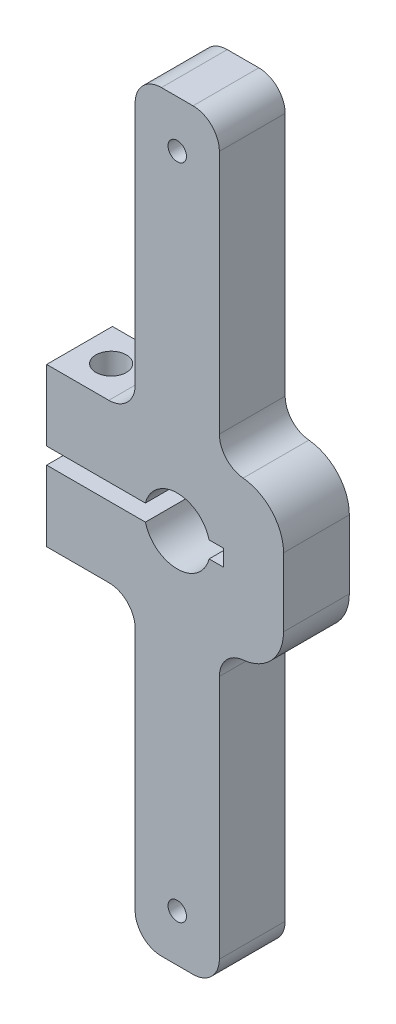
ISO-10303-21;
HEADER;
FILE_DESCRIPTION(('STEP AP214'),'2;1');
FILE_NAME('part.step','',(''),(''),'','','');
FILE_SCHEMA(('AUTOMOTIVE_DESIGN { 1 0 10303 214 1 1 1 1 }'));
ENDSEC;
DATA;
#1=APPLICATION_CONTEXT('core data for automotive mechanical design processes');
#2=APPLICATION_PROTOCOL_DEFINITION('international standard','automotive_design',2000,#1);
#3=PRODUCT_CONTEXT('',#1,'mechanical');
#4=PRODUCT('Part','Part','',(#3));
#5=PRODUCT_RELATED_PRODUCT_CATEGORY('part','',(#4));
#6=PRODUCT_DEFINITION_FORMATION('','',#4);
#7=PRODUCT_DEFINITION_CONTEXT('part definition',#1,'design');
#8=PRODUCT_DEFINITION('design','',#6,#7);
#9=PRODUCT_DEFINITION_SHAPE('','',#8);
#10=(LENGTH_UNIT() NAMED_UNIT(*) SI_UNIT(.MILLI.,.METRE.));
#11=(NAMED_UNIT(*) PLANE_ANGLE_UNIT() SI_UNIT($,.RADIAN.));
#12=(NAMED_UNIT(*) SI_UNIT($,.STERADIAN.) SOLID_ANGLE_UNIT());
#13=UNCERTAINTY_MEASURE_WITH_UNIT(LENGTH_MEASURE(1.E-05),#10,'distance_accuracy_value','');
#14=(GEOMETRIC_REPRESENTATION_CONTEXT(3) GLOBAL_UNCERTAINTY_ASSIGNED_CONTEXT((#13)) GLOBAL_UNIT_ASSIGNED_CONTEXT((#10,
#11,#12)) REPRESENTATION_CONTEXT('',''));
#15=CARTESIAN_POINT('',(0.,0.,0.));
#16=DIRECTION('',(0.,0.,1.));
#17=DIRECTION('',(1.,0.,0.));
#18=AXIS2_PLACEMENT_3D('',#15,#16,#17);
#19=CARTESIAN_POINT('',(-21.4924927341236,7.62,6.35));
#20=DIRECTION('',(0.,-1.,0.));
#21=DIRECTION('',(0.,0.,-1.));
#22=AXIS2_PLACEMENT_3D('',#19,#20,#21);
#23=PLANE('',#22);
#24=CARTESIAN_POINT('',(-18.4444927341236,7.62,3.175));
#25=DIRECTION('',(0.,-1.,0.));
#26=DIRECTION('',(0.,0.,-1.));
#27=AXIS2_PLACEMENT_3D('',#24,#25,#26);
#28=CIRCLE('',#27,1.4732);
#29=CARTESIAN_POINT('',(-18.4444927341236,7.62,1.7018));
#30=VERTEX_POINT('',#29);
#31=EDGE_CURVE('E315',#30,#30,#28,.T.);
#32=ORIENTED_EDGE('',*,*,#31,.T.);
#33=EDGE_LOOP('',(#32));
#34=FACE_BOUND('',#33,.T.);
#35=DIRECTION('',(-1.,0.,0.));
#36=VECTOR('',#35,1.);
#37=CARTESIAN_POINT('',(-6.25249273412365,7.62,6.35));
#38=LINE('',#37,#36);
#39=CARTESIAN_POINT('',(-15.494,7.62,6.35));
#40=VERTEX_POINT('',#39);
#41=CARTESIAN_POINT('',(-21.4924927341236,7.62,6.35));
#42=VERTEX_POINT('',#41);
#43=EDGE_CURVE('E267',#40,#42,#38,.T.);
#44=ORIENTED_EDGE('',*,*,#43,.F.);
#45=DIRECTION('',(0.,0.,1.));
#46=VECTOR('',#45,1.);
#47=CARTESIAN_POINT('',(-15.494,7.62,0.));
#48=LINE('',#47,#46);
#49=CARTESIAN_POINT('',(-15.494,7.62,0.));
#50=VERTEX_POINT('',#49);
#51=EDGE_CURVE('E356',#40,#50,#48,.F.);
#52=ORIENTED_EDGE('',*,*,#51,.T.);
#53=DIRECTION('',(-1.,0.,0.));
#54=VECTOR('',#53,1.);
#55=CARTESIAN_POINT('',(-21.4924927341236,7.62,0.));
#56=LINE('',#55,#54);
#57=CARTESIAN_POINT('',(-21.4924927341236,7.62,0.));
#58=VERTEX_POINT('',#57);
#59=EDGE_CURVE('E259',#50,#58,#56,.T.);
#60=ORIENTED_EDGE('',*,*,#59,.T.);
#61=DIRECTION('',(0.,0.,-1.));
#62=VECTOR('',#61,1.);
#63=CARTESIAN_POINT('',(-21.4924927341236,7.62,6.35));
#64=LINE('',#63,#62);
#65=EDGE_CURVE('E229',#42,#58,#64,.T.);
#66=ORIENTED_EDGE('',*,*,#65,.F.);
#67=EDGE_LOOP('',(#44,#52,#60,#66));
#68=FACE_BOUND('',#67,.T.);
#69=ADVANCED_FACE('F35',(#34,#68),#23,.F.);
#70=CARTESIAN_POINT('',(-4.445,-0.793749999999996,0.));
#71=DIRECTION('',(0.,-1.,0.));
#72=DIRECTION('',(1.,0.,0.));
#73=AXIS2_PLACEMENT_3D('',#70,#71,#72);
#74=PLANE('',#73);
#75=DIRECTION('',(1.,0.,0.));
#76=VECTOR('',#75,1.);
#77=CARTESIAN_POINT('',(-4.445,-0.793749999999996,0.));
#78=LINE('',#77,#76);
#79=CARTESIAN_POINT('',(-5.81581946894786,-0.793749999999997,0.));
#80=VERTEX_POINT('',#79);
#81=CARTESIAN_POINT('',(-4.445,-0.793749999999996,0.));
#82=VERTEX_POINT('',#81);
#83=EDGE_CURVE('E427',#80,#82,#78,.T.);
#84=ORIENTED_EDGE('',*,*,#83,.F.);
#85=DIRECTION('',(0.,0.,1.));
#86=VECTOR('',#85,1.);
#87=CARTESIAN_POINT('',(-5.81581946894786,-0.793749999999997,0.));
#88=LINE('',#87,#86);
#89=CARTESIAN_POINT('',(-5.81581946894786,-0.793749999999997,6.35));
#90=VERTEX_POINT('',#89);
#91=EDGE_CURVE('E418',#80,#90,#88,.T.);
#92=ORIENTED_EDGE('',*,*,#91,.T.);
#93=DIRECTION('',(1.,0.,0.));
#94=VECTOR('',#93,1.);
#95=CARTESIAN_POINT('',(-4.445,-0.793749999999996,6.35));
#96=LINE('',#95,#94);
#97=CARTESIAN_POINT('',(-4.445,-0.793749999999996,6.35));
#98=VERTEX_POINT('',#97);
#99=EDGE_CURVE('E246',#90,#98,#96,.T.);
#100=ORIENTED_EDGE('',*,*,#99,.T.);
#101=DIRECTION('',(0.,0.,1.));
#102=VECTOR('',#101,1.);
#103=CARTESIAN_POINT('',(-4.445,-0.793749999999996,0.));
#104=LINE('',#103,#102);
#105=EDGE_CURVE('E256',#82,#98,#104,.T.);
#106=ORIENTED_EDGE('',*,*,#105,.F.);
#107=EDGE_LOOP('',(#84,#92,#100,#106));
#108=FACE_BOUND('',#107,.T.);
#109=ADVANCED_FACE('F434',(#108),#74,.F.);
#110=CARTESIAN_POINT('',(-4.445,0.793750000000003,0.));
#111=DIRECTION('',(0.,1.,0.));
#112=DIRECTION('',(-1.,0.,0.));
#113=AXIS2_PLACEMENT_3D('',#110,#111,#112);
#114=PLANE('',#113);
#115=CARTESIAN_POINT('',(-18.4444927341236,0.793750000000001,3.175));
#116=DIRECTION('',(0.,1.,0.));
#117=DIRECTION('',(-1.,0.,0.));
#118=AXIS2_PLACEMENT_3D('',#115,#116,#117);
#119=CIRCLE('',#118,1.47319999999999);
#120=CARTESIAN_POINT('',(-19.9176927341236,0.793750000000001,3.175));
#121=VERTEX_POINT('',#120);
#122=EDGE_CURVE('E314',#121,#121,#119,.T.);
#123=ORIENTED_EDGE('',*,*,#122,.T.);
#124=EDGE_LOOP('',(#123));
#125=FACE_BOUND('',#124,.T.);
#126=DIRECTION('',(-1.,0.,0.));
#127=VECTOR('',#126,1.);
#128=CARTESIAN_POINT('',(-4.445,0.793750000000003,0.));
#129=LINE('',#128,#127);
#130=CARTESIAN_POINT('',(-11.9641805310521,0.793750000000002,0.));
#131=VERTEX_POINT('',#130);
#132=CARTESIAN_POINT('',(-21.4924927341236,0.79375,0.));
#133=VERTEX_POINT('',#132);
#134=EDGE_CURVE('E412',#131,#133,#129,.T.);
#135=ORIENTED_EDGE('',*,*,#134,.F.);
#136=DIRECTION('',(0.,0.,1.));
#137=VECTOR('',#136,1.);
#138=CARTESIAN_POINT('',(-11.9641805310521,0.793750000000002,0.));
#139=LINE('',#138,#137);
#140=CARTESIAN_POINT('',(-11.9641805310521,0.793750000000002,6.35));
#141=VERTEX_POINT('',#140);
#142=EDGE_CURVE('E228',#131,#141,#139,.T.);
#143=ORIENTED_EDGE('',*,*,#142,.T.);
#144=DIRECTION('',(-1.,0.,0.));
#145=VECTOR('',#144,1.);
#146=CARTESIAN_POINT('',(-4.445,0.793750000000003,6.35));
#147=LINE('',#146,#145);
#148=CARTESIAN_POINT('',(-21.4924927341236,0.793750000000001,6.35));
#149=VERTEX_POINT('',#148);
#150=EDGE_CURVE('E239',#141,#149,#147,.T.);
#151=ORIENTED_EDGE('',*,*,#150,.T.);
#152=DIRECTION('',(0.,0.,1.));
#153=VECTOR('',#152,1.);
#154=CARTESIAN_POINT('',(-21.4924927341236,0.793750000000001,0.));
#155=LINE('',#154,#153);
#156=EDGE_CURVE('E262',#133,#149,#155,.T.);
#157=ORIENTED_EDGE('',*,*,#156,.F.);
#158=EDGE_LOOP('',(#135,#143,#151,#157));
#159=FACE_BOUND('',#158,.T.);
#160=ADVANCED_FACE('F411',(#125,#159),#114,.F.);
#161=CARTESIAN_POINT('',(-21.4924927341236,-7.62,6.35));
#162=DIRECTION('',(1.,0.,0.));
#163=DIRECTION('',(0.,0.,-1.));
#164=AXIS2_PLACEMENT_3D('',#161,#162,#163);
#165=PLANE('',#164);
#166=DIRECTION('',(0.,-1.,0.));
#167=VECTOR('',#166,1.);
#168=CARTESIAN_POINT('',(-21.4924927341236,-7.62,6.35));
#169=LINE('',#168,#167);
#170=CARTESIAN_POINT('',(-21.4924927341236,-0.793750000000002,6.35));
#171=VERTEX_POINT('',#170);
#172=CARTESIAN_POINT('',(-21.4924927341236,-7.62,6.35));
#173=VERTEX_POINT('',#172);
#174=EDGE_CURVE('E269',#171,#173,#169,.T.);
#175=ORIENTED_EDGE('',*,*,#174,.F.);
#176=DIRECTION('',(0.,0.,1.));
#177=VECTOR('',#176,1.);
#178=CARTESIAN_POINT('',(-21.4924927341236,-0.793750000000002,0.));
#179=LINE('',#178,#177);
#180=CARTESIAN_POINT('',(-21.4924927341236,-0.793750000000002,0.));
#181=VERTEX_POINT('',#180);
#182=EDGE_CURVE('E260',#181,#171,#179,.T.);
#183=ORIENTED_EDGE('',*,*,#182,.F.);
#184=DIRECTION('',(0.,-1.,0.));
#185=VECTOR('',#184,1.);
#186=CARTESIAN_POINT('',(-21.4924927341236,-7.62,0.));
#187=LINE('',#186,#185);
#188=CARTESIAN_POINT('',(-21.4924927341236,-7.62,0.));
#189=VERTEX_POINT('',#188);
#190=EDGE_CURVE('E281',#181,#189,#187,.T.);
#191=ORIENTED_EDGE('',*,*,#190,.T.);
#192=DIRECTION('',(0.,0.,-1.));
#193=VECTOR('',#192,1.);
#194=CARTESIAN_POINT('',(-21.4924927341236,-7.62,6.35));
#195=LINE('',#194,#193);
#196=EDGE_CURVE('E279',#173,#189,#195,.T.);
#197=ORIENTED_EDGE('',*,*,#196,.F.);
#198=EDGE_LOOP('',(#175,#183,#191,#197));
#199=FACE_BOUND('',#198,.T.);
#200=ADVANCED_FACE('F446',(#199),#165,.F.);
#201=EDGE_CURVE('E282',#58,#133,#187,.T.);
#202=ORIENTED_EDGE('',*,*,#201,.T.);
#203=ORIENTED_EDGE('',*,*,#156,.T.);
#204=EDGE_CURVE('E271',#42,#149,#169,.T.);
#205=ORIENTED_EDGE('',*,*,#204,.F.);
#206=ORIENTED_EDGE('',*,*,#65,.T.);
#207=EDGE_LOOP('',(#202,#203,#205,#206));
#208=FACE_BOUND('',#207,.T.);
#209=ADVANCED_FACE('F407',(#208),#165,.F.);
#210=CARTESIAN_POINT('',(-6.25249273412365,-7.62,6.35));
#211=DIRECTION('',(0.,1.,0.));
#212=DIRECTION('',(0.,0.,1.));
#213=AXIS2_PLACEMENT_3D('',#210,#211,#212);
#214=PLANE('',#213);
#215=CARTESIAN_POINT('',(-18.4444927341236,-7.62,3.175));
#216=DIRECTION('',(0.,-1.,0.));
#217=DIRECTION('',(0.,0.,-1.));
#218=AXIS2_PLACEMENT_3D('',#215,#216,#217);
#219=CIRCLE('',#218,1.47319999999999);
#220=CARTESIAN_POINT('',(-18.4444927341236,-7.62,1.70180000000001));
#221=VERTEX_POINT('',#220);
#222=EDGE_CURVE('E398',#221,#221,#219,.T.);
#223=ORIENTED_EDGE('',*,*,#222,.F.);
#224=EDGE_LOOP('',(#223));
#225=FACE_BOUND('',#224,.T.);
#226=DIRECTION('',(1.,0.,0.));
#227=VECTOR('',#226,1.);
#228=CARTESIAN_POINT('',(-6.25249273412365,-7.62,0.));
#229=LINE('',#228,#227);
#230=CARTESIAN_POINT('',(-15.494,-7.62,0.));
#231=VERTEX_POINT('',#230);
#232=EDGE_CURVE('E285',#189,#231,#229,.T.);
#233=ORIENTED_EDGE('',*,*,#232,.T.);
#234=DIRECTION('',(0.,0.,1.));
#235=VECTOR('',#234,1.);
#236=CARTESIAN_POINT('',(-15.494,-7.62,6.35));
#237=LINE('',#236,#235);
#238=CARTESIAN_POINT('',(-15.494,-7.62,6.35));
#239=VERTEX_POINT('',#238);
#240=EDGE_CURVE('E340',#231,#239,#237,.T.);
#241=ORIENTED_EDGE('',*,*,#240,.T.);
#242=DIRECTION('',(1.,0.,0.));
#243=VECTOR('',#242,1.);
#244=CARTESIAN_POINT('',(-21.4924927341236,-7.62,6.35));
#245=LINE('',#244,#243);
#246=EDGE_CURVE('E273',#173,#239,#245,.T.);
#247=ORIENTED_EDGE('',*,*,#246,.F.);
#248=ORIENTED_EDGE('',*,*,#196,.T.);
#249=EDGE_LOOP('',(#233,#241,#247,#248));
#250=FACE_BOUND('',#249,.T.);
#251=ADVANCED_FACE('F454',(#225,#250),#214,.F.);
#252=CARTESIAN_POINT('',(1.36750726587635,7.62,6.35));
#253=DIRECTION('',(-1.,0.,0.));
#254=DIRECTION('',(0.,-1.,0.));
#255=AXIS2_PLACEMENT_3D('',#252,#253,#254);
#256=PLANE('',#255);
#257=DIRECTION('',(0.,1.,0.));
#258=VECTOR('',#257,1.);
#259=CARTESIAN_POINT('',(1.36750726587635,0.,6.35));
#260=LINE('',#259,#258);
#261=CARTESIAN_POINT('',(1.36750726587635,-3.302,6.35));
#262=VERTEX_POINT('',#261);
#263=CARTESIAN_POINT('',(1.36750726587635,3.302,6.35));
#264=VERTEX_POINT('',#263);
#265=EDGE_CURVE('E276',#262,#264,#260,.T.);
#266=ORIENTED_EDGE('',*,*,#265,.F.);
#267=DIRECTION('',(0.,0.,-1.));
#268=VECTOR('',#267,1.);
#269=CARTESIAN_POINT('',(1.36750726587635,-3.302,6.35));
#270=LINE('',#269,#268);
#271=CARTESIAN_POINT('',(1.36750726587635,-3.302,0.));
#272=VERTEX_POINT('',#271);
#273=EDGE_CURVE('E297',#262,#272,#270,.T.);
#274=ORIENTED_EDGE('',*,*,#273,.T.);
#275=DIRECTION('',(0.,1.,0.));
#276=VECTOR('',#275,1.);
#277=CARTESIAN_POINT('',(1.36750726587635,7.62,0.));
#278=LINE('',#277,#276);
#279=CARTESIAN_POINT('',(1.36750726587635,3.302,0.));
#280=VERTEX_POINT('',#279);
#281=EDGE_CURVE('E270',#272,#280,#278,.T.);
#282=ORIENTED_EDGE('',*,*,#281,.T.);
#283=DIRECTION('',(0.,0.,-1.));
#284=VECTOR('',#283,1.);
#285=CARTESIAN_POINT('',(1.36750726587635,3.302,6.35));
#286=LINE('',#285,#284);
#287=EDGE_CURVE('E295',#280,#264,#286,.F.);
#288=ORIENTED_EDGE('',*,*,#287,.T.);
#289=EDGE_LOOP('',(#266,#274,#282,#288));
#290=FACE_BOUND('',#289,.T.);
#291=ADVANCED_FACE('F643',(#290),#256,.F.);
#292=CARTESIAN_POINT('',(1.36750726587635,7.62,6.35));
#293=DIRECTION('',(0.,0.,-1.));
#294=DIRECTION('',(-1.,0.,0.));
#295=AXIS2_PLACEMENT_3D('',#292,#293,#294);
#296=PLANE('',#295);
#297=CARTESIAN_POINT('',(-8.89,-31.75,6.35));
#298=DIRECTION('',(0.,0.,-1.));
#299=DIRECTION('',(-1.,0.,0.));
#300=AXIS2_PLACEMENT_3D('',#297,#298,#299);
#301=CIRCLE('',#300,0.888999999999997);
#302=CARTESIAN_POINT('',(-9.77899999999999,-31.75,6.35));
#303=VERTEX_POINT('',#302);
#304=EDGE_CURVE('E582',#303,#303,#301,.T.);
#305=ORIENTED_EDGE('',*,*,#304,.T.);
#306=EDGE_LOOP('',(#305));
#307=FACE_BOUND('',#306,.T.);
#308=CARTESIAN_POINT('',(-8.89,31.75,6.35));
#309=DIRECTION('',(0.,0.,-1.));
#310=DIRECTION('',(-1.,0.,0.));
#311=AXIS2_PLACEMENT_3D('',#308,#309,#310);
#312=CIRCLE('',#311,0.888999999999997);
#313=CARTESIAN_POINT('',(-9.77899999999999,31.75,6.35));
#314=VERTEX_POINT('',#313);
#315=EDGE_CURVE('E604',#314,#314,#312,.T.);
#316=ORIENTED_EDGE('',*,*,#315,.T.);
#317=EDGE_LOOP('',(#316));
#318=FACE_BOUND('',#317,.T.);
#319=DIRECTION('',(0.,1.,0.));
#320=VECTOR('',#319,1.);
#321=CARTESIAN_POINT('',(-12.954,-36.2966,6.35));
#322=LINE('',#321,#320);
#323=CARTESIAN_POINT('',(-12.954,-33.7566,6.35));
#324=VERTEX_POINT('',#323);
#325=CARTESIAN_POINT('',(-12.954,-10.16,6.35));
#326=VERTEX_POINT('',#325);
#327=EDGE_CURVE('E456',#324,#326,#322,.T.);
#328=ORIENTED_EDGE('',*,*,#327,.F.);
#329=CARTESIAN_POINT('',(-10.414,-33.7566,6.35));
#330=DIRECTION('',(0.,0.,-1.));
#331=DIRECTION('',(-1.,0.,0.));
#332=AXIS2_PLACEMENT_3D('',#329,#330,#331);
#333=CIRCLE('',#332,2.54);
#334=CARTESIAN_POINT('',(-10.414,-36.2966,6.35));
#335=VERTEX_POINT('',#334);
#336=EDGE_CURVE('E326',#324,#335,#333,.F.);
#337=ORIENTED_EDGE('',*,*,#336,.T.);
#338=DIRECTION('',(1.,0.,0.));
#339=VECTOR('',#338,1.);
#340=CARTESIAN_POINT('',(-4.82599999999999,-36.2966,6.35));
#341=LINE('',#340,#339);
#342=CARTESIAN_POINT('',(-7.366,-36.2966,6.35));
#343=VERTEX_POINT('',#342);
#344=EDGE_CURVE('E592',#335,#343,#341,.T.);
#345=ORIENTED_EDGE('',*,*,#344,.T.);
#346=CARTESIAN_POINT('',(-7.366,-33.7566,6.35));
#347=DIRECTION('',(0.,0.,-1.));
#348=DIRECTION('',(-1.,0.,0.));
#349=AXIS2_PLACEMENT_3D('',#346,#347,#348);
#350=CIRCLE('',#349,2.54);
#351=CARTESIAN_POINT('',(-4.82599999999999,-33.7566,6.35));
#352=VERTEX_POINT('',#351);
#353=EDGE_CURVE('E324',#343,#352,#350,.F.);
#354=ORIENTED_EDGE('',*,*,#353,.T.);
#355=DIRECTION('',(0.,1.,0.));
#356=VECTOR('',#355,1.);
#357=CARTESIAN_POINT('',(-4.82599999999999,-36.2966,6.35));
#358=LINE('',#357,#356);
#359=CARTESIAN_POINT('',(-4.82599999999999,-10.1277317121534,6.35));
#360=VERTEX_POINT('',#359);
#361=EDGE_CURVE('E463',#352,#360,#358,.T.);
#362=ORIENTED_EDGE('',*,*,#361,.T.);
#363=CARTESIAN_POINT('',(-2.28599999999999,-10.1277317121534,6.35));
#364=DIRECTION('',(0.,0.,-1.));
#365=DIRECTION('',(-1.,0.,0.));
#366=AXIS2_PLACEMENT_3D('',#363,#364,#365);
#367=CIRCLE('',#366,2.54);
#368=CARTESIAN_POINT('',(-2.53210842004579,-7.59968292987438,6.35));
#369=VERTEX_POINT('',#368);
#370=EDGE_CURVE('E376',#360,#369,#367,.T.);
#371=ORIENTED_EDGE('',*,*,#370,.T.);
#372=CARTESIAN_POINT('',(-2.95049273412365,-3.302,6.35));
#373=DIRECTION('',(0.,0.,-1.));
#374=DIRECTION('',(-1.,0.,0.));
#375=AXIS2_PLACEMENT_3D('',#372,#373,#374);
#376=CIRCLE('',#375,4.318);
#377=EDGE_CURVE('E308',#369,#262,#376,.F.);
#378=ORIENTED_EDGE('',*,*,#377,.T.);
#379=ORIENTED_EDGE('',*,*,#265,.T.);
#380=CARTESIAN_POINT('',(-2.95049273412365,3.302,6.35));
#381=DIRECTION('',(0.,0.,-1.));
#382=DIRECTION('',(-1.,0.,0.));
#383=AXIS2_PLACEMENT_3D('',#380,#381,#382);
#384=CIRCLE('',#383,4.318);
#385=CARTESIAN_POINT('',(-2.53210842004579,7.59968292987438,6.35));
#386=VERTEX_POINT('',#385);
#387=EDGE_CURVE('E305',#264,#386,#384,.F.);
#388=ORIENTED_EDGE('',*,*,#387,.T.);
#389=CARTESIAN_POINT('',(-2.28599999999999,10.1277317121534,6.35));
#390=DIRECTION('',(0.,0.,-1.));
#391=DIRECTION('',(-1.,0.,0.));
#392=AXIS2_PLACEMENT_3D('',#389,#390,#391);
#393=CIRCLE('',#392,2.54);
#394=CARTESIAN_POINT('',(-4.82599999999999,10.1277317121534,6.35));
#395=VERTEX_POINT('',#394);
#396=EDGE_CURVE('E11',#386,#395,#393,.T.);
#397=ORIENTED_EDGE('',*,*,#396,.T.);
#398=DIRECTION('',(0.,-1.,0.));
#399=VECTOR('',#398,1.);
#400=CARTESIAN_POINT('',(-4.82599999999999,36.2966,6.35));
#401=LINE('',#400,#399);
#402=CARTESIAN_POINT('',(-4.82599999999999,33.7566,6.35));
#403=VERTEX_POINT('',#402);
#404=EDGE_CURVE('E514',#403,#395,#401,.T.);
#405=ORIENTED_EDGE('',*,*,#404,.F.);
#406=CARTESIAN_POINT('',(-7.366,33.7566,6.35));
#407=DIRECTION('',(0.,0.,-1.));
#408=DIRECTION('',(-1.,0.,0.));
#409=AXIS2_PLACEMENT_3D('',#406,#407,#408);
#410=CIRCLE('',#409,2.54);
#411=CARTESIAN_POINT('',(-7.366,36.2966,6.35));
#412=VERTEX_POINT('',#411);
#413=EDGE_CURVE('E320',#403,#412,#410,.F.);
#414=ORIENTED_EDGE('',*,*,#413,.T.);
#415=DIRECTION('',(1.,0.,0.));
#416=VECTOR('',#415,1.);
#417=CARTESIAN_POINT('',(-4.82599999999999,36.2966,6.35));
#418=LINE('',#417,#416);
#419=CARTESIAN_POINT('',(-10.414,36.2966,6.35));
#420=VERTEX_POINT('',#419);
#421=EDGE_CURVE('E523',#420,#412,#418,.T.);
#422=ORIENTED_EDGE('',*,*,#421,.F.);
#423=CARTESIAN_POINT('',(-10.414,33.7566,6.35));
#424=DIRECTION('',(0.,0.,-1.));
#425=DIRECTION('',(-1.,0.,0.));
#426=AXIS2_PLACEMENT_3D('',#423,#424,#425);
#427=CIRCLE('',#426,2.54);
#428=CARTESIAN_POINT('',(-12.954,33.7566,6.35));
#429=VERTEX_POINT('',#428);
#430=EDGE_CURVE('E322',#420,#429,#427,.F.);
#431=ORIENTED_EDGE('',*,*,#430,.T.);
#432=DIRECTION('',(0.,-1.,0.));
#433=VECTOR('',#432,1.);
#434=CARTESIAN_POINT('',(-12.954,36.2966,6.35));
#435=LINE('',#434,#433);
#436=CARTESIAN_POINT('',(-12.954,10.16,6.35));
#437=VERTEX_POINT('',#436);
#438=EDGE_CURVE('E399',#429,#437,#435,.T.);
#439=ORIENTED_EDGE('',*,*,#438,.T.);
#440=CARTESIAN_POINT('',(-15.494,10.16,6.35));
#441=DIRECTION('',(0.,0.,-1.));
#442=DIRECTION('',(-1.,0.,0.));
#443=AXIS2_PLACEMENT_3D('',#440,#441,#442);
#444=CIRCLE('',#443,2.54);
#445=EDGE_CURVE('E378',#437,#40,#444,.T.);
#446=ORIENTED_EDGE('',*,*,#445,.T.);
#447=ORIENTED_EDGE('',*,*,#43,.T.);
#448=ORIENTED_EDGE('',*,*,#204,.T.);
#449=ORIENTED_EDGE('',*,*,#150,.F.);
#450=CARTESIAN_POINT('',(-8.89,0.,6.35));
#451=DIRECTION('',(0.,0.,1.));
#452=DIRECTION('',(1.,0.,0.));
#453=AXIS2_PLACEMENT_3D('',#450,#451,#452);
#454=CIRCLE('',#453,3.175);
#455=CARTESIAN_POINT('',(-5.81581946894786,0.793750000000003,6.35));
#456=VERTEX_POINT('',#455);
#457=EDGE_CURVE('E220',#456,#141,#454,.T.);
#458=ORIENTED_EDGE('',*,*,#457,.F.);
#459=CARTESIAN_POINT('',(-4.445,0.793750000000003,6.35));
#460=VERTEX_POINT('',#459);
#461=EDGE_CURVE('E237',#460,#456,#147,.T.);
#462=ORIENTED_EDGE('',*,*,#461,.F.);
#463=DIRECTION('',(0.,1.,0.));
#464=VECTOR('',#463,1.);
#465=CARTESIAN_POINT('',(-4.445,-0.793749999999996,6.35));
#466=LINE('',#465,#464);
#467=EDGE_CURVE('E250',#98,#460,#466,.T.);
#468=ORIENTED_EDGE('',*,*,#467,.F.);
#469=ORIENTED_EDGE('',*,*,#99,.F.);
#470=CARTESIAN_POINT('',(-11.9641805310521,-0.793749999999999,6.35));
#471=VERTEX_POINT('',#470);
#472=EDGE_CURVE('E241',#471,#90,#454,.T.);
#473=ORIENTED_EDGE('',*,*,#472,.F.);
#474=EDGE_CURVE('E248',#171,#471,#96,.T.);
#475=ORIENTED_EDGE('',*,*,#474,.F.);
#476=ORIENTED_EDGE('',*,*,#174,.T.);
#477=ORIENTED_EDGE('',*,*,#246,.T.);
#478=CARTESIAN_POINT('',(-15.494,-10.16,6.35));
#479=DIRECTION('',(0.,0.,-1.));
#480=DIRECTION('',(-1.,0.,0.));
#481=AXIS2_PLACEMENT_3D('',#478,#479,#480);
#482=CIRCLE('',#481,2.54);
#483=EDGE_CURVE('E370',#239,#326,#482,.T.);
#484=ORIENTED_EDGE('',*,*,#483,.T.);
#485=EDGE_LOOP('',(#328,#337,#345,#354,#362,#371,#378,#379,#388,#397,#405,#414,#422,#431,#439,
#446,#447,#448,#449,#458,#462,#468,#469,#473,#475,#476,#477,#484));
#486=FACE_BOUND('',#485,.T.);
#487=ADVANCED_FACE('F235',(#307,#318,#486),#296,.F.);
#488=CARTESIAN_POINT('',(1.36750726587635,7.62,0.));
#489=DIRECTION('',(0.,0.,-1.));
#490=DIRECTION('',(-1.,0.,0.));
#491=AXIS2_PLACEMENT_3D('',#488,#489,#490);
#492=PLANE('',#491);
#493=CARTESIAN_POINT('',(-8.89,-31.75,0.));
#494=DIRECTION('',(0.,0.,-1.));
#495=DIRECTION('',(-1.,0.,0.));
#496=AXIS2_PLACEMENT_3D('',#493,#494,#495);
#497=CIRCLE('',#496,0.888999999999999);
#498=CARTESIAN_POINT('',(-9.77899999999999,-31.75,0.));
#499=VERTEX_POINT('',#498);
#500=EDGE_CURVE('E585',#499,#499,#497,.T.);
#501=ORIENTED_EDGE('',*,*,#500,.F.);
#502=EDGE_LOOP('',(#501));
#503=FACE_BOUND('',#502,.T.);
#504=CARTESIAN_POINT('',(-8.89,31.75,0.));
#505=DIRECTION('',(0.,0.,-1.));
#506=DIRECTION('',(-1.,0.,0.));
#507=AXIS2_PLACEMENT_3D('',#504,#505,#506);
#508=CIRCLE('',#507,0.888999999999999);
#509=CARTESIAN_POINT('',(-9.77899999999999,31.75,0.));
#510=VERTEX_POINT('',#509);
#511=EDGE_CURVE('E601',#510,#510,#508,.T.);
#512=ORIENTED_EDGE('',*,*,#511,.F.);
#513=EDGE_LOOP('',(#512));
#514=FACE_BOUND('',#513,.T.);
#515=DIRECTION('',(-1.,0.,0.));
#516=VECTOR('',#515,1.);
#517=CARTESIAN_POINT('',(-12.954,-36.2966,0.));
#518=LINE('',#517,#516);
#519=CARTESIAN_POINT('',(-7.366,-36.2966,0.));
#520=VERTEX_POINT('',#519);
#521=CARTESIAN_POINT('',(-10.414,-36.2966,0.));
#522=VERTEX_POINT('',#521);
#523=EDGE_CURVE('E588',#520,#522,#518,.T.);
#524=ORIENTED_EDGE('',*,*,#523,.T.);
#525=CARTESIAN_POINT('',(-10.414,-33.7566,0.));
#526=DIRECTION('',(0.,0.,-1.));
#527=DIRECTION('',(-1.,0.,0.));
#528=AXIS2_PLACEMENT_3D('',#525,#526,#527);
#529=CIRCLE('',#528,2.54);
#530=CARTESIAN_POINT('',(-12.954,-33.7566,0.));
#531=VERTEX_POINT('',#530);
#532=EDGE_CURVE('E338',#522,#531,#529,.T.);
#533=ORIENTED_EDGE('',*,*,#532,.T.);
#534=DIRECTION('',(0.,1.,0.));
#535=VECTOR('',#534,1.);
#536=CARTESIAN_POINT('',(-12.954,-36.2966,0.));
#537=LINE('',#536,#535);
#538=CARTESIAN_POINT('',(-12.954,-10.16,0.));
#539=VERTEX_POINT('',#538);
#540=EDGE_CURVE('E464',#531,#539,#537,.T.);
#541=ORIENTED_EDGE('',*,*,#540,.T.);
#542=CARTESIAN_POINT('',(-15.494,-10.16,0.));
#543=DIRECTION('',(0.,0.,-1.));
#544=DIRECTION('',(-1.,0.,0.));
#545=AXIS2_PLACEMENT_3D('',#542,#543,#544);
#546=CIRCLE('',#545,2.54);
#547=EDGE_CURVE('E372',#539,#231,#546,.F.);
#548=ORIENTED_EDGE('',*,*,#547,.T.);
#549=ORIENTED_EDGE('',*,*,#232,.F.);
#550=ORIENTED_EDGE('',*,*,#190,.F.);
#551=CARTESIAN_POINT('',(-11.9641805310521,-0.793749999999999,0.));
#552=VERTEX_POINT('',#551);
#553=EDGE_CURVE('E266',#181,#552,#78,.T.);
#554=ORIENTED_EDGE('',*,*,#553,.T.);
#555=CARTESIAN_POINT('',(-8.89,0.,0.));
#556=DIRECTION('',(0.,0.,1.));
#557=DIRECTION('',(1.,0.,0.));
#558=AXIS2_PLACEMENT_3D('',#555,#556,#557);
#559=CIRCLE('',#558,3.175);
#560=EDGE_CURVE('E240',#552,#80,#559,.T.);
#561=ORIENTED_EDGE('',*,*,#560,.T.);
#562=ORIENTED_EDGE('',*,*,#83,.T.);
#563=DIRECTION('',(0.,1.,0.));
#564=VECTOR('',#563,1.);
#565=CARTESIAN_POINT('',(-4.445,-0.793749999999996,0.));
#566=LINE('',#565,#564);
#567=CARTESIAN_POINT('',(-4.445,0.793750000000003,0.));
#568=VERTEX_POINT('',#567);
#569=EDGE_CURVE('E255',#82,#568,#566,.T.);
#570=ORIENTED_EDGE('',*,*,#569,.T.);
#571=CARTESIAN_POINT('',(-5.81581946894786,0.793750000000003,0.));
#572=VERTEX_POINT('',#571);
#573=EDGE_CURVE('E414',#568,#572,#129,.T.);
#574=ORIENTED_EDGE('',*,*,#573,.T.);
#575=EDGE_CURVE('E223',#572,#131,#559,.T.);
#576=ORIENTED_EDGE('',*,*,#575,.T.);
#577=ORIENTED_EDGE('',*,*,#134,.T.);
#578=ORIENTED_EDGE('',*,*,#201,.F.);
#579=ORIENTED_EDGE('',*,*,#59,.F.);
#580=CARTESIAN_POINT('',(-15.494,10.16,0.));
#581=DIRECTION('',(0.,0.,-1.));
#582=DIRECTION('',(-1.,0.,0.));
#583=AXIS2_PLACEMENT_3D('',#580,#581,#582);
#584=CIRCLE('',#583,2.54);
#585=CARTESIAN_POINT('',(-12.954,10.16,0.));
#586=VERTEX_POINT('',#585);
#587=EDGE_CURVE('E380',#50,#586,#584,.F.);
#588=ORIENTED_EDGE('',*,*,#587,.T.);
#589=DIRECTION('',(0.,-1.,0.));
#590=VECTOR('',#589,1.);
#591=CARTESIAN_POINT('',(-12.954,36.2966,0.));
#592=LINE('',#591,#590);
#593=CARTESIAN_POINT('',(-12.954,33.7566,0.));
#594=VERTEX_POINT('',#593);
#595=EDGE_CURVE('E387',#594,#586,#592,.T.);
#596=ORIENTED_EDGE('',*,*,#595,.F.);
#597=CARTESIAN_POINT('',(-10.414,33.7566,0.));
#598=DIRECTION('',(0.,0.,-1.));
#599=DIRECTION('',(-1.,0.,0.));
#600=AXIS2_PLACEMENT_3D('',#597,#598,#599);
#601=CIRCLE('',#600,2.54);
#602=CARTESIAN_POINT('',(-10.414,36.2966,0.));
#603=VERTEX_POINT('',#602);
#604=EDGE_CURVE('E334',#594,#603,#601,.T.);
#605=ORIENTED_EDGE('',*,*,#604,.T.);
#606=DIRECTION('',(-1.,0.,0.));
#607=VECTOR('',#606,1.);
#608=CARTESIAN_POINT('',(-12.954,36.2966,0.));
#609=LINE('',#608,#607);
#610=CARTESIAN_POINT('',(-7.366,36.2966,0.));
#611=VERTEX_POINT('',#610);
#612=EDGE_CURVE('E607',#611,#603,#609,.T.);
#613=ORIENTED_EDGE('',*,*,#612,.F.);
#614=CARTESIAN_POINT('',(-7.366,33.7566,0.));
#615=DIRECTION('',(0.,0.,-1.));
#616=DIRECTION('',(-1.,0.,0.));
#617=AXIS2_PLACEMENT_3D('',#614,#615,#616);
#618=CIRCLE('',#617,2.54);
#619=CARTESIAN_POINT('',(-4.826,33.7566,0.));
#620=VERTEX_POINT('',#619);
#621=EDGE_CURVE('E332',#611,#620,#618,.T.);
#622=ORIENTED_EDGE('',*,*,#621,.T.);
#623=DIRECTION('',(0.,-1.,0.));
#624=VECTOR('',#623,1.);
#625=CARTESIAN_POINT('',(-4.826,36.2966,0.));
#626=LINE('',#625,#624);
#627=CARTESIAN_POINT('',(-4.826,10.1277317121534,0.));
#628=VERTEX_POINT('',#627);
#629=EDGE_CURVE('E520',#620,#628,#626,.T.);
#630=ORIENTED_EDGE('',*,*,#629,.T.);
#631=CARTESIAN_POINT('',(-2.28599999999999,10.1277317121534,0.));
#632=DIRECTION('',(0.,0.,-1.));
#633=DIRECTION('',(-1.,0.,0.));
#634=AXIS2_PLACEMENT_3D('',#631,#632,#633);
#635=CIRCLE('',#634,2.54);
#636=CARTESIAN_POINT('',(-2.53210842004579,7.59968292987438,0.));
#637=VERTEX_POINT('',#636);
#638=EDGE_CURVE('E43',#628,#637,#635,.F.);
#639=ORIENTED_EDGE('',*,*,#638,.T.);
#640=CARTESIAN_POINT('',(-2.95049273412365,3.302,0.));
#641=DIRECTION('',(0.,0.,-1.));
#642=DIRECTION('',(-1.,0.,0.));
#643=AXIS2_PLACEMENT_3D('',#640,#641,#642);
#644=CIRCLE('',#643,4.318);
#645=EDGE_CURVE('E300',#637,#280,#644,.T.);
#646=ORIENTED_EDGE('',*,*,#645,.T.);
#647=ORIENTED_EDGE('',*,*,#281,.F.);
#648=CARTESIAN_POINT('',(-2.95049273412365,-3.302,0.));
#649=DIRECTION('',(0.,0.,-1.));
#650=DIRECTION('',(-1.,0.,0.));
#651=AXIS2_PLACEMENT_3D('',#648,#649,#650);
#652=CIRCLE('',#651,4.318);
#653=CARTESIAN_POINT('',(-2.53210842004579,-7.59968292987438,0.));
#654=VERTEX_POINT('',#653);
#655=EDGE_CURVE('E302',#272,#654,#652,.T.);
#656=ORIENTED_EDGE('',*,*,#655,.T.);
#657=CARTESIAN_POINT('',(-2.28599999999999,-10.1277317121534,0.));
#658=DIRECTION('',(0.,0.,-1.));
#659=DIRECTION('',(-1.,0.,0.));
#660=AXIS2_PLACEMENT_3D('',#657,#658,#659);
#661=CIRCLE('',#660,2.54);
#662=CARTESIAN_POINT('',(-4.826,-10.1277317121534,0.));
#663=VERTEX_POINT('',#662);
#664=EDGE_CURVE('E374',#654,#663,#661,.F.);
#665=ORIENTED_EDGE('',*,*,#664,.T.);
#666=DIRECTION('',(0.,1.,0.));
#667=VECTOR('',#666,1.);
#668=CARTESIAN_POINT('',(-4.826,-36.2966,0.));
#669=LINE('',#668,#667);
#670=CARTESIAN_POINT('',(-4.826,-33.7566,0.));
#671=VERTEX_POINT('',#670);
#672=EDGE_CURVE('E598',#671,#663,#669,.T.);
#673=ORIENTED_EDGE('',*,*,#672,.F.);
#674=CARTESIAN_POINT('',(-7.366,-33.7566,0.));
#675=DIRECTION('',(0.,0.,-1.));
#676=DIRECTION('',(-1.,0.,0.));
#677=AXIS2_PLACEMENT_3D('',#674,#675,#676);
#678=CIRCLE('',#677,2.54);
#679=EDGE_CURVE('E336',#671,#520,#678,.T.);
#680=ORIENTED_EDGE('',*,*,#679,.T.);
#681=EDGE_LOOP('',(#524,#533,#541,#548,#549,#550,#554,#561,#562,#570,#574,#576,#577,#578,#579,
#588,#596,#605,#613,#622,#630,#639,#646,#647,#656,#665,#673,#680));
#682=FACE_BOUND('',#681,.T.);
#683=ADVANCED_FACE('F386',(#503,#514,#682),#492,.T.);
#684=CARTESIAN_POINT('',(-4.445,-0.793749999999996,0.));
#685=DIRECTION('',(1.,0.,0.));
#686=DIRECTION('',(0.,0.,-1.));
#687=AXIS2_PLACEMENT_3D('',#684,#685,#686);
#688=PLANE('',#687);
#689=ORIENTED_EDGE('',*,*,#467,.T.);
#690=DIRECTION('',(0.,0.,1.));
#691=VECTOR('',#690,1.);
#692=CARTESIAN_POINT('',(-4.445,0.793750000000003,0.));
#693=LINE('',#692,#691);
#694=EDGE_CURVE('E244',#568,#460,#693,.T.);
#695=ORIENTED_EDGE('',*,*,#694,.F.);
#696=ORIENTED_EDGE('',*,*,#569,.F.);
#697=ORIENTED_EDGE('',*,*,#105,.T.);
#698=EDGE_LOOP('',(#689,#695,#696,#697));
#699=FACE_BOUND('',#698,.T.);
#700=ADVANCED_FACE('F437',(#699),#688,.F.);
#701=CARTESIAN_POINT('',(-18.4444927341236,-0.793750000000001,3.175));
#702=DIRECTION('',(0.,-1.,0.));
#703=DIRECTION('',(1.,0.,0.));
#704=AXIS2_PLACEMENT_3D('',#701,#702,#703);
#705=CIRCLE('',#704,1.47319999999999);
#706=CARTESIAN_POINT('',(-16.9712927341237,-0.79375,3.175));
#707=VERTEX_POINT('',#706);
#708=EDGE_CURVE('E311',#707,#707,#705,.T.);
#709=ORIENTED_EDGE('',*,*,#708,.T.);
#710=EDGE_LOOP('',(#709));
#711=FACE_BOUND('',#710,.T.);
#712=ORIENTED_EDGE('',*,*,#474,.T.);
#713=DIRECTION('',(0.,0.,1.));
#714=VECTOR('',#713,1.);
#715=CARTESIAN_POINT('',(-11.9641805310521,-0.793749999999999,0.));
#716=LINE('',#715,#714);
#717=EDGE_CURVE('E415',#471,#552,#716,.F.);
#718=ORIENTED_EDGE('',*,*,#717,.T.);
#719=ORIENTED_EDGE('',*,*,#553,.F.);
#720=ORIENTED_EDGE('',*,*,#182,.T.);
#721=EDGE_LOOP('',(#712,#718,#719,#720));
#722=FACE_BOUND('',#721,.T.);
#723=ADVANCED_FACE('F443',(#711,#722),#74,.F.);
#724=ORIENTED_EDGE('',*,*,#461,.T.);
#725=DIRECTION('',(0.,0.,1.));
#726=VECTOR('',#725,1.);
#727=CARTESIAN_POINT('',(-5.81581946894786,0.793750000000003,0.));
#728=LINE('',#727,#726);
#729=EDGE_CURVE('E217',#456,#572,#728,.F.);
#730=ORIENTED_EDGE('',*,*,#729,.T.);
#731=ORIENTED_EDGE('',*,*,#573,.F.);
#732=ORIENTED_EDGE('',*,*,#694,.T.);
#733=EDGE_LOOP('',(#724,#730,#731,#732));
#734=FACE_BOUND('',#733,.T.);
#735=ADVANCED_FACE('F243',(#734),#114,.F.);
#736=CARTESIAN_POINT('',(-8.89,0.,0.));
#737=DIRECTION('',(0.,0.,1.));
#738=DIRECTION('',(1.,0.,0.));
#739=AXIS2_PLACEMENT_3D('',#736,#737,#738);
#740=CYLINDRICAL_SURFACE('',#739,3.175);
#741=ORIENTED_EDGE('',*,*,#575,.F.);
#742=ORIENTED_EDGE('',*,*,#729,.F.);
#743=ORIENTED_EDGE('',*,*,#457,.T.);
#744=ORIENTED_EDGE('',*,*,#142,.F.);
#745=EDGE_LOOP('',(#741,#742,#743,#744));
#746=FACE_BOUND('',#745,.T.);
#747=ADVANCED_FACE('F219',(#746),#740,.F.);
#748=ORIENTED_EDGE('',*,*,#560,.F.);
#749=ORIENTED_EDGE('',*,*,#717,.F.);
#750=ORIENTED_EDGE('',*,*,#472,.T.);
#751=ORIENTED_EDGE('',*,*,#91,.F.);
#752=EDGE_LOOP('',(#748,#749,#750,#751));
#753=FACE_BOUND('',#752,.T.);
#754=ADVANCED_FACE('F496',(#753),#740,.F.);
#755=CARTESIAN_POINT('',(-2.95049273412365,-3.302,6.35));
#756=DIRECTION('',(0.,0.,-1.));
#757=DIRECTION('',(-1.,0.,0.));
#758=AXIS2_PLACEMENT_3D('',#755,#756,#757);
#759=CYLINDRICAL_SURFACE('',#758,4.318);
#760=ORIENTED_EDGE('',*,*,#377,.F.);
#761=DIRECTION('',(0.,0.,-1.));
#762=VECTOR('',#761,1.);
#763=CARTESIAN_POINT('',(-2.53210842004579,-7.59968292987438,6.35));
#764=LINE('',#763,#762);
#765=EDGE_CURVE('E343',#369,#654,#764,.T.);
#766=ORIENTED_EDGE('',*,*,#765,.T.);
#767=ORIENTED_EDGE('',*,*,#655,.F.);
#768=ORIENTED_EDGE('',*,*,#273,.F.);
#769=EDGE_LOOP('',(#760,#766,#767,#768));
#770=FACE_BOUND('',#769,.T.);
#771=ADVANCED_FACE('F492',(#770),#759,.T.);
#772=CARTESIAN_POINT('',(-2.95049273412365,3.302,6.35));
#773=DIRECTION('',(0.,0.,-1.));
#774=DIRECTION('',(-1.,0.,0.));
#775=AXIS2_PLACEMENT_3D('',#772,#773,#774);
#776=CYLINDRICAL_SURFACE('',#775,4.318);
#777=ORIENTED_EDGE('',*,*,#645,.F.);
#778=DIRECTION('',(0.,0.,-1.));
#779=VECTOR('',#778,1.);
#780=CARTESIAN_POINT('',(-2.53210842004579,7.59968292987438,6.35));
#781=LINE('',#780,#779);
#782=EDGE_CURVE('E362',#637,#386,#781,.F.);
#783=ORIENTED_EDGE('',*,*,#782,.T.);
#784=ORIENTED_EDGE('',*,*,#387,.F.);
#785=ORIENTED_EDGE('',*,*,#287,.F.);
#786=EDGE_LOOP('',(#777,#783,#784,#785));
#787=FACE_BOUND('',#786,.T.);
#788=ADVANCED_FACE('F495',(#787),#776,.T.);
#789=CARTESIAN_POINT('',(-18.4444927341236,-7.62,3.175));
#790=DIRECTION('',(0.,-1.,0.));
#791=DIRECTION('',(0.,0.,-1.));
#792=AXIS2_PLACEMENT_3D('',#789,#790,#791);
#793=CYLINDRICAL_SURFACE('',#792,1.47319999999999);
#794=ORIENTED_EDGE('',*,*,#222,.T.);
#795=EDGE_LOOP('',(#794));
#796=FACE_BOUND('',#795,.T.);
#797=ORIENTED_EDGE('',*,*,#708,.F.);
#798=EDGE_LOOP('',(#797));
#799=FACE_BOUND('',#798,.T.);
#800=ADVANCED_FACE('F499',(#796,#799),#793,.F.);
#801=ORIENTED_EDGE('',*,*,#31,.F.);
#802=EDGE_LOOP('',(#801));
#803=FACE_BOUND('',#802,.T.);
#804=ORIENTED_EDGE('',*,*,#122,.F.);
#805=EDGE_LOOP('',(#804));
#806=FACE_BOUND('',#805,.T.);
#807=ADVANCED_FACE('F504',(#803,#806),#793,.F.);
#808=CARTESIAN_POINT('',(-12.954,36.2966,6.35));
#809=DIRECTION('',(1.,0.,0.));
#810=DIRECTION('',(0.,0.,-1.));
#811=AXIS2_PLACEMENT_3D('',#808,#809,#810);
#812=PLANE('',#811);
#813=ORIENTED_EDGE('',*,*,#595,.T.);
#814=DIRECTION('',(0.,0.,1.));
#815=VECTOR('',#814,1.);
#816=CARTESIAN_POINT('',(-12.954,10.16,6.35));
#817=LINE('',#816,#815);
#818=EDGE_CURVE('E353',#586,#437,#817,.T.);
#819=ORIENTED_EDGE('',*,*,#818,.T.);
#820=ORIENTED_EDGE('',*,*,#438,.F.);
#821=DIRECTION('',(0.,0.,1.));
#822=VECTOR('',#821,1.);
#823=CARTESIAN_POINT('',(-12.954,33.7566,6.35));
#824=LINE('',#823,#822);
#825=EDGE_CURVE('E351',#429,#594,#824,.F.);
#826=ORIENTED_EDGE('',*,*,#825,.T.);
#827=EDGE_LOOP('',(#813,#819,#820,#826));
#828=FACE_BOUND('',#827,.T.);
#829=ADVANCED_FACE('F394',(#828),#812,.F.);
#830=CARTESIAN_POINT('',(-4.826,36.2966,0.));
#831=DIRECTION('',(-1.,0.,0.));
#832=DIRECTION('',(0.,0.,1.));
#833=AXIS2_PLACEMENT_3D('',#830,#831,#832);
#834=PLANE('',#833);
#835=ORIENTED_EDGE('',*,*,#404,.T.);
#836=DIRECTION('',(0.,0.,-1.));
#837=VECTOR('',#836,1.);
#838=CARTESIAN_POINT('',(-4.826,10.1277317121534,0.));
#839=LINE('',#838,#837);
#840=EDGE_CURVE('E360',#395,#628,#839,.T.);
#841=ORIENTED_EDGE('',*,*,#840,.T.);
#842=ORIENTED_EDGE('',*,*,#629,.F.);
#843=DIRECTION('',(0.,0.,-1.));
#844=VECTOR('',#843,1.);
#845=CARTESIAN_POINT('',(-4.826,33.7566,0.));
#846=LINE('',#845,#844);
#847=EDGE_CURVE('E358',#620,#403,#846,.F.);
#848=ORIENTED_EDGE('',*,*,#847,.T.);
#849=EDGE_LOOP('',(#835,#841,#842,#848));
#850=FACE_BOUND('',#849,.T.);
#851=ADVANCED_FACE('F517',(#850),#834,.F.);
#852=CARTESIAN_POINT('',(-4.826,36.2966,0.));
#853=DIRECTION('',(0.,-1.,0.));
#854=DIRECTION('',(0.,0.,-1.));
#855=AXIS2_PLACEMENT_3D('',#852,#853,#854);
#856=PLANE('',#855);
#857=ORIENTED_EDGE('',*,*,#612,.T.);
#858=DIRECTION('',(0.,0.,1.));
#859=VECTOR('',#858,1.);
#860=CARTESIAN_POINT('',(-10.414,36.2966,0.));
#861=LINE('',#860,#859);
#862=EDGE_CURVE('E367',#603,#420,#861,.T.);
#863=ORIENTED_EDGE('',*,*,#862,.T.);
#864=ORIENTED_EDGE('',*,*,#421,.T.);
#865=DIRECTION('',(0.,0.,-1.));
#866=VECTOR('',#865,1.);
#867=CARTESIAN_POINT('',(-7.366,36.2966,0.));
#868=LINE('',#867,#866);
#869=EDGE_CURVE('E364',#412,#611,#868,.T.);
#870=ORIENTED_EDGE('',*,*,#869,.T.);
#871=EDGE_LOOP('',(#857,#863,#864,#870));
#872=FACE_BOUND('',#871,.T.);
#873=ADVANCED_FACE('F557',(#872),#856,.F.);
#874=CARTESIAN_POINT('',(-8.89,31.75,0.));
#875=DIRECTION('',(0.,0.,-1.));
#876=DIRECTION('',(-1.,0.,0.));
#877=AXIS2_PLACEMENT_3D('',#874,#875,#876);
#878=CYLINDRICAL_SURFACE('',#877,0.888999999999998);
#879=ORIENTED_EDGE('',*,*,#315,.F.);
#880=EDGE_LOOP('',(#879));
#881=FACE_BOUND('',#880,.T.);
#882=ORIENTED_EDGE('',*,*,#511,.T.);
#883=EDGE_LOOP('',(#882));
#884=FACE_BOUND('',#883,.T.);
#885=ADVANCED_FACE('F560',(#881,#884),#878,.F.);
#886=CARTESIAN_POINT('',(-4.826,-36.2966,0.));
#887=DIRECTION('',(1.,0.,0.));
#888=DIRECTION('',(0.,0.,-1.));
#889=AXIS2_PLACEMENT_3D('',#886,#887,#888);
#890=PLANE('',#889);
#891=ORIENTED_EDGE('',*,*,#672,.T.);
#892=DIRECTION('',(0.,0.,1.));
#893=VECTOR('',#892,1.);
#894=CARTESIAN_POINT('',(-4.82599999999999,-10.1277317121534,6.35));
#895=LINE('',#894,#893);
#896=EDGE_CURVE('E349',#663,#360,#895,.T.);
#897=ORIENTED_EDGE('',*,*,#896,.T.);
#898=ORIENTED_EDGE('',*,*,#361,.F.);
#899=DIRECTION('',(0.,0.,-1.));
#900=VECTOR('',#899,1.);
#901=CARTESIAN_POINT('',(-4.826,-33.7566,0.));
#902=LINE('',#901,#900);
#903=EDGE_CURVE('E346',#352,#671,#902,.T.);
#904=ORIENTED_EDGE('',*,*,#903,.T.);
#905=EDGE_LOOP('',(#891,#897,#898,#904));
#906=FACE_BOUND('',#905,.T.);
#907=ADVANCED_FACE('F564',(#906),#890,.T.);
#908=CARTESIAN_POINT('',(-12.954,-36.2966,6.35));
#909=DIRECTION('',(-1.,0.,0.));
#910=DIRECTION('',(0.,0.,1.));
#911=AXIS2_PLACEMENT_3D('',#908,#909,#910);
#912=PLANE('',#911);
#913=ORIENTED_EDGE('',*,*,#540,.F.);
#914=DIRECTION('',(0.,0.,1.));
#915=VECTOR('',#914,1.);
#916=CARTESIAN_POINT('',(-12.954,-33.7566,6.35));
#917=LINE('',#916,#915);
#918=EDGE_CURVE('E317',#531,#324,#917,.T.);
#919=ORIENTED_EDGE('',*,*,#918,.T.);
#920=ORIENTED_EDGE('',*,*,#327,.T.);
#921=DIRECTION('',(0.,0.,1.));
#922=VECTOR('',#921,1.);
#923=CARTESIAN_POINT('',(-12.954,-10.16,6.35));
#924=LINE('',#923,#922);
#925=EDGE_CURVE('E310',#326,#539,#924,.F.);
#926=ORIENTED_EDGE('',*,*,#925,.T.);
#927=EDGE_LOOP('',(#913,#919,#920,#926));
#928=FACE_BOUND('',#927,.T.);
#929=ADVANCED_FACE('F461',(#928),#912,.T.);
#930=CARTESIAN_POINT('',(-4.826,-36.2966,0.));
#931=DIRECTION('',(0.,1.,0.));
#932=DIRECTION('',(0.,0.,-1.));
#933=AXIS2_PLACEMENT_3D('',#930,#931,#932);
#934=PLANE('',#933);
#935=ORIENTED_EDGE('',*,*,#344,.F.);
#936=DIRECTION('',(0.,0.,1.));
#937=VECTOR('',#936,1.);
#938=CARTESIAN_POINT('',(-10.414,-36.2966,0.));
#939=LINE('',#938,#937);
#940=EDGE_CURVE('E330',#335,#522,#939,.F.);
#941=ORIENTED_EDGE('',*,*,#940,.T.);
#942=ORIENTED_EDGE('',*,*,#523,.F.);
#943=DIRECTION('',(0.,0.,-1.));
#944=VECTOR('',#943,1.);
#945=CARTESIAN_POINT('',(-7.366,-36.2966,6.35));
#946=LINE('',#945,#944);
#947=EDGE_CURVE('E328',#520,#343,#946,.F.);
#948=ORIENTED_EDGE('',*,*,#947,.T.);
#949=EDGE_LOOP('',(#935,#941,#942,#948));
#950=FACE_BOUND('',#949,.T.);
#951=ADVANCED_FACE('F571',(#950),#934,.F.);
#952=CARTESIAN_POINT('',(-8.89,-31.75,0.));
#953=DIRECTION('',(0.,0.,-1.));
#954=DIRECTION('',(-1.,0.,0.));
#955=AXIS2_PLACEMENT_3D('',#952,#953,#954);
#956=CYLINDRICAL_SURFACE('',#955,0.888999999999998);
#957=ORIENTED_EDGE('',*,*,#304,.F.);
#958=EDGE_LOOP('',(#957));
#959=FACE_BOUND('',#958,.T.);
#960=ORIENTED_EDGE('',*,*,#500,.T.);
#961=EDGE_LOOP('',(#960));
#962=FACE_BOUND('',#961,.T.);
#963=ADVANCED_FACE('F478',(#959,#962),#956,.F.);
#964=CARTESIAN_POINT('',(-10.414,-33.7566,6.35));
#965=DIRECTION('',(0.,0.,-1.));
#966=DIRECTION('',(-1.,0.,0.));
#967=AXIS2_PLACEMENT_3D('',#964,#965,#966);
#968=CYLINDRICAL_SURFACE('',#967,2.54);
#969=ORIENTED_EDGE('',*,*,#532,.F.);
#970=ORIENTED_EDGE('',*,*,#940,.F.);
#971=ORIENTED_EDGE('',*,*,#336,.F.);
#972=ORIENTED_EDGE('',*,*,#918,.F.);
#973=EDGE_LOOP('',(#969,#970,#971,#972));
#974=FACE_BOUND('',#973,.T.);
#975=ADVANCED_FACE('F469',(#974),#968,.T.);
#976=CARTESIAN_POINT('',(-15.494,-10.16,6.35));
#977=DIRECTION('',(0.,0.,1.));
#978=DIRECTION('',(1.,0.,0.));
#979=AXIS2_PLACEMENT_3D('',#976,#977,#978);
#980=CYLINDRICAL_SURFACE('',#979,2.54);
#981=ORIENTED_EDGE('',*,*,#547,.F.);
#982=ORIENTED_EDGE('',*,*,#925,.F.);
#983=ORIENTED_EDGE('',*,*,#483,.F.);
#984=ORIENTED_EDGE('',*,*,#240,.F.);
#985=EDGE_LOOP('',(#981,#982,#983,#984));
#986=FACE_BOUND('',#985,.T.);
#987=ADVANCED_FACE('F466',(#986),#980,.F.);
#988=CARTESIAN_POINT('',(-2.28599999999999,-10.1277317121534,6.35));
#989=DIRECTION('',(0.,0.,-1.));
#990=DIRECTION('',(-1.,0.,0.));
#991=AXIS2_PLACEMENT_3D('',#988,#989,#990);
#992=CYLINDRICAL_SURFACE('',#991,2.54);
#993=ORIENTED_EDGE('',*,*,#370,.F.);
#994=ORIENTED_EDGE('',*,*,#896,.F.);
#995=ORIENTED_EDGE('',*,*,#664,.F.);
#996=ORIENTED_EDGE('',*,*,#765,.F.);
#997=EDGE_LOOP('',(#993,#994,#995,#996));
#998=FACE_BOUND('',#997,.T.);
#999=ADVANCED_FACE('F468',(#998),#992,.F.);
#1000=CARTESIAN_POINT('',(-7.366,-33.7566,0.));
#1001=DIRECTION('',(0.,0.,1.));
#1002=DIRECTION('',(1.,0.,0.));
#1003=AXIS2_PLACEMENT_3D('',#1000,#1001,#1002);
#1004=CYLINDRICAL_SURFACE('',#1003,2.54);
#1005=ORIENTED_EDGE('',*,*,#353,.F.);
#1006=ORIENTED_EDGE('',*,*,#947,.F.);
#1007=ORIENTED_EDGE('',*,*,#679,.F.);
#1008=ORIENTED_EDGE('',*,*,#903,.F.);
#1009=EDGE_LOOP('',(#1005,#1006,#1007,#1008));
#1010=FACE_BOUND('',#1009,.T.);
#1011=ADVANCED_FACE('F475',(#1010),#1004,.T.);
#1012=CARTESIAN_POINT('',(-15.494,10.16,6.35));
#1013=DIRECTION('',(0.,0.,-1.));
#1014=DIRECTION('',(-1.,0.,0.));
#1015=AXIS2_PLACEMENT_3D('',#1012,#1013,#1014);
#1016=CYLINDRICAL_SURFACE('',#1015,2.54);
#1017=ORIENTED_EDGE('',*,*,#587,.F.);
#1018=ORIENTED_EDGE('',*,*,#51,.F.);
#1019=ORIENTED_EDGE('',*,*,#445,.F.);
#1020=ORIENTED_EDGE('',*,*,#818,.F.);
#1021=EDGE_LOOP('',(#1017,#1018,#1019,#1020));
#1022=FACE_BOUND('',#1021,.T.);
#1023=ADVANCED_FACE('F401',(#1022),#1016,.F.);
#1024=CARTESIAN_POINT('',(-2.28599999999999,10.1277317121534,6.35));
#1025=DIRECTION('',(0.,0.,-1.));
#1026=DIRECTION('',(-1.,0.,0.));
#1027=AXIS2_PLACEMENT_3D('',#1024,#1025,#1026);
#1028=CYLINDRICAL_SURFACE('',#1027,2.54);
#1029=ORIENTED_EDGE('',*,*,#396,.F.);
#1030=ORIENTED_EDGE('',*,*,#782,.F.);
#1031=ORIENTED_EDGE('',*,*,#638,.F.);
#1032=ORIENTED_EDGE('',*,*,#840,.F.);
#1033=EDGE_LOOP('',(#1029,#1030,#1031,#1032));
#1034=FACE_BOUND('',#1033,.T.);
#1035=ADVANCED_FACE('F511',(#1034),#1028,.F.);
#1036=CARTESIAN_POINT('',(-10.414,33.7566,0.));
#1037=DIRECTION('',(0.,0.,1.));
#1038=DIRECTION('',(1.,0.,0.));
#1039=AXIS2_PLACEMENT_3D('',#1036,#1037,#1038);
#1040=CYLINDRICAL_SURFACE('',#1039,2.54);
#1041=ORIENTED_EDGE('',*,*,#604,.F.);
#1042=ORIENTED_EDGE('',*,*,#825,.F.);
#1043=ORIENTED_EDGE('',*,*,#430,.F.);
#1044=ORIENTED_EDGE('',*,*,#862,.F.);
#1045=EDGE_LOOP('',(#1041,#1042,#1043,#1044));
#1046=FACE_BOUND('',#1045,.T.);
#1047=ADVANCED_FACE('F616',(#1046),#1040,.T.);
#1048=CARTESIAN_POINT('',(-7.366,33.7566,0.));
#1049=DIRECTION('',(0.,0.,-1.));
#1050=DIRECTION('',(-1.,0.,0.));
#1051=AXIS2_PLACEMENT_3D('',#1048,#1049,#1050);
#1052=CYLINDRICAL_SURFACE('',#1051,2.54);
#1053=ORIENTED_EDGE('',*,*,#413,.F.);
#1054=ORIENTED_EDGE('',*,*,#847,.F.);
#1055=ORIENTED_EDGE('',*,*,#621,.F.);
#1056=ORIENTED_EDGE('',*,*,#869,.F.);
#1057=EDGE_LOOP('',(#1053,#1054,#1055,#1056));
#1058=FACE_BOUND('',#1057,.T.);
#1059=ADVANCED_FACE('F37',(#1058),#1052,.T.);
#1060=CLOSED_SHELL('',(#69,#109,#160,#200,#209,#251,#291,#487,#683,#700,#723,#735,#747,#754,
#771,#788,#800,#807,#829,#851,#873,#885,#907,#929,#951,#963,#975,#987,#999,#1011,#1023,#1035,
#1047,#1059));
#1061=MANIFOLD_SOLID_BREP('B2',#1060);
#1062=ADVANCED_BREP_SHAPE_REPRESENTATION('',(#18,#1061),#14);
#1063=SHAPE_DEFINITION_REPRESENTATION(#9,#1062);
ENDSEC;
END-ISO-10303-21;
